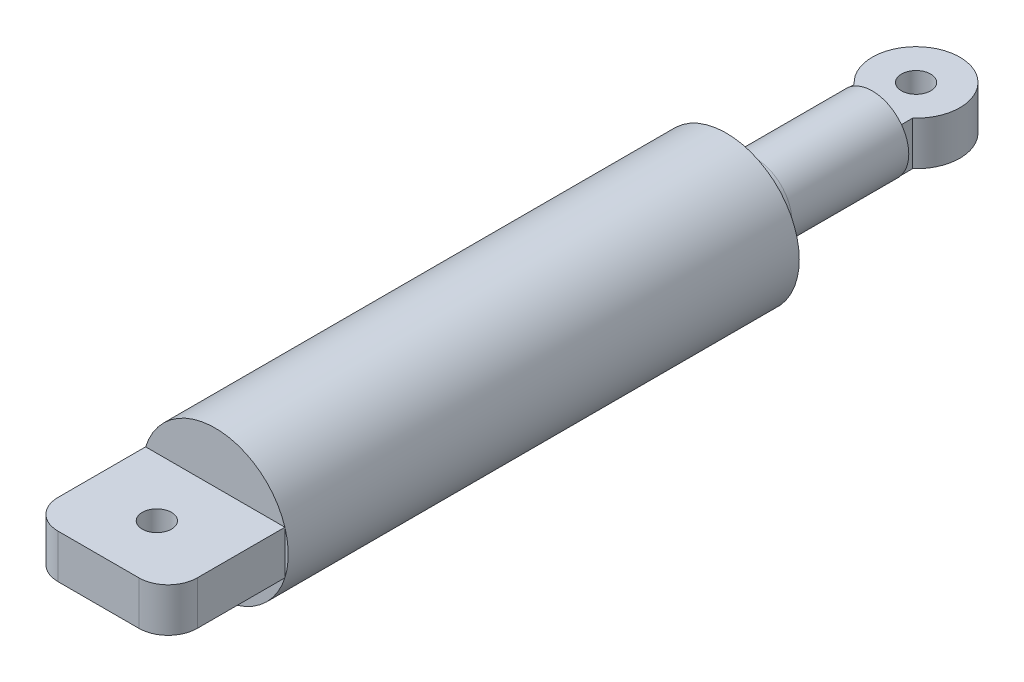
ISO-10303-21;
HEADER;
FILE_DESCRIPTION(('STEP AP214'),'2;1');
FILE_NAME('part.step','',(''),(''),'','','');
FILE_SCHEMA(('AUTOMOTIVE_DESIGN { 1 0 10303 214 1 1 1 1 }'));
ENDSEC;
DATA;
#1=APPLICATION_CONTEXT('core data for automotive mechanical design processes');
#2=APPLICATION_PROTOCOL_DEFINITION('international standard','automotive_design',2000,#1);
#3=PRODUCT_CONTEXT('',#1,'mechanical');
#4=PRODUCT('Part','Part','',(#3));
#5=PRODUCT_RELATED_PRODUCT_CATEGORY('part','',(#4));
#6=PRODUCT_DEFINITION_FORMATION('','',#4);
#7=PRODUCT_DEFINITION_CONTEXT('part definition',#1,'design');
#8=PRODUCT_DEFINITION('design','',#6,#7);
#9=PRODUCT_DEFINITION_SHAPE('','',#8);
#10=(LENGTH_UNIT() NAMED_UNIT(*) SI_UNIT(.MILLI.,.METRE.));
#11=(NAMED_UNIT(*) PLANE_ANGLE_UNIT() SI_UNIT($,.RADIAN.));
#12=(NAMED_UNIT(*) SI_UNIT($,.STERADIAN.) SOLID_ANGLE_UNIT());
#13=UNCERTAINTY_MEASURE_WITH_UNIT(LENGTH_MEASURE(1.E-05),#10,'distance_accuracy_value','');
#14=(GEOMETRIC_REPRESENTATION_CONTEXT(3) GLOBAL_UNCERTAINTY_ASSIGNED_CONTEXT((#13)) GLOBAL_UNIT_ASSIGNED_CONTEXT((#10,
#11,#12)) REPRESENTATION_CONTEXT('',''));
#15=CARTESIAN_POINT('',(0.,0.,0.));
#16=DIRECTION('',(0.,0.,1.));
#17=DIRECTION('',(1.,0.,0.));
#18=AXIS2_PLACEMENT_3D('',#15,#16,#17);
#19=CARTESIAN_POINT('',(0.,0.,-10.));
#20=DIRECTION('',(0.,0.,-1.));
#21=DIRECTION('',(-1.,0.,0.));
#22=AXIS2_PLACEMENT_3D('',#19,#20,#21);
#23=PLANE('',#22);
#24=DIRECTION('',(0.,1.,0.));
#25=VECTOR('',#24,1.);
#26=CARTESIAN_POINT('',(-2.,1.5,-10.));
#27=LINE('',#26,#25);
#28=CARTESIAN_POINT('',(-2.,-1.5,-10.));
#29=VERTEX_POINT('',#28);
#30=CARTESIAN_POINT('',(-2.,1.5,-10.));
#31=VERTEX_POINT('',#30);
#32=EDGE_CURVE('E137',#29,#31,#27,.T.);
#33=ORIENTED_EDGE('',*,*,#32,.F.);
#34=CARTESIAN_POINT('',(0.,0.,-10.));
#35=DIRECTION('',(0.,0.,-1.));
#36=DIRECTION('',(-1.,0.,0.));
#37=AXIS2_PLACEMENT_3D('',#34,#35,#36);
#38=CIRCLE('',#37,2.5);
#39=EDGE_CURVE('E159',#29,#31,#38,.T.);
#40=ORIENTED_EDGE('',*,*,#39,.T.);
#41=EDGE_LOOP('',(#33,#40));
#42=FACE_BOUND('',#41,.T.);
#43=ADVANCED_FACE('F44',(#42),#23,.T.);
#44=DIRECTION('',(-1.,0.,0.));
#45=VECTOR('',#44,1.);
#46=CARTESIAN_POINT('',(2.,-1.5,-10.));
#47=LINE('',#46,#45);
#48=CARTESIAN_POINT('',(2.,-1.5,-10.));
#49=VERTEX_POINT('',#48);
#50=EDGE_CURVE('E169',#49,#29,#47,.T.);
#51=ORIENTED_EDGE('',*,*,#50,.F.);
#52=EDGE_CURVE('E164',#49,#29,#38,.T.);
#53=ORIENTED_EDGE('',*,*,#52,.T.);
#54=EDGE_LOOP('',(#51,#53));
#55=FACE_BOUND('',#54,.T.);
#56=ADVANCED_FACE('F291',(#55),#23,.T.);
#57=DIRECTION('',(0.,-1.,0.));
#58=VECTOR('',#57,1.);
#59=CARTESIAN_POINT('',(2.,1.5,-10.));
#60=LINE('',#59,#58);
#61=CARTESIAN_POINT('',(2.,1.5,-10.));
#62=VERTEX_POINT('',#61);
#63=EDGE_CURVE('E136',#62,#49,#60,.T.);
#64=ORIENTED_EDGE('',*,*,#63,.F.);
#65=EDGE_CURVE('E157',#62,#49,#38,.T.);
#66=ORIENTED_EDGE('',*,*,#65,.T.);
#67=EDGE_LOOP('',(#64,#66));
#68=FACE_BOUND('',#67,.T.);
#69=ADVANCED_FACE('F167',(#68),#23,.T.);
#70=CARTESIAN_POINT('',(0.,0.,35.));
#71=DIRECTION('',(0.,0.,1.));
#72=DIRECTION('',(1.,0.,0.));
#73=AXIS2_PLACEMENT_3D('',#70,#71,#72);
#74=PLANE('',#73);
#75=DIRECTION('',(0.,1.,0.));
#76=VECTOR('',#75,1.);
#77=CARTESIAN_POINT('',(4.76969600708473,1.5,35.));
#78=LINE('',#77,#76);
#79=CARTESIAN_POINT('',(4.76969600708473,-1.5,35.));
#80=VERTEX_POINT('',#79);
#81=CARTESIAN_POINT('',(4.76969600708473,1.5,35.));
#82=VERTEX_POINT('',#81);
#83=EDGE_CURVE('E156',#80,#82,#78,.T.);
#84=ORIENTED_EDGE('',*,*,#83,.F.);
#85=CARTESIAN_POINT('',(0.,0.,35.));
#86=DIRECTION('',(0.,0.,1.));
#87=DIRECTION('',(1.,0.,0.));
#88=AXIS2_PLACEMENT_3D('',#85,#86,#87);
#89=CIRCLE('',#88,5.);
#90=EDGE_CURVE('E225',#80,#82,#89,.T.);
#91=ORIENTED_EDGE('',*,*,#90,.T.);
#92=EDGE_LOOP('',(#84,#91));
#93=FACE_BOUND('',#92,.T.);
#94=ADVANCED_FACE('F322',(#93),#74,.T.);
#95=DIRECTION('',(1.,0.,0.));
#96=VECTOR('',#95,1.);
#97=CARTESIAN_POINT('',(-4.76969600708473,-1.5,35.));
#98=LINE('',#97,#96);
#99=CARTESIAN_POINT('',(-4.76969600708473,-1.5,35.));
#100=VERTEX_POINT('',#99);
#101=EDGE_CURVE('E188',#100,#80,#98,.T.);
#102=ORIENTED_EDGE('',*,*,#101,.F.);
#103=EDGE_CURVE('E296',#100,#80,#89,.T.);
#104=ORIENTED_EDGE('',*,*,#103,.T.);
#105=EDGE_LOOP('',(#102,#104));
#106=FACE_BOUND('',#105,.T.);
#107=ADVANCED_FACE('F324',(#106),#74,.T.);
#108=DIRECTION('',(0.,-1.,0.));
#109=VECTOR('',#108,1.);
#110=CARTESIAN_POINT('',(-4.76969600708473,1.5,35.));
#111=LINE('',#110,#109);
#112=CARTESIAN_POINT('',(-4.76969600708473,1.5,35.));
#113=VERTEX_POINT('',#112);
#114=EDGE_CURVE('E200',#113,#100,#111,.T.);
#115=ORIENTED_EDGE('',*,*,#114,.F.);
#116=EDGE_CURVE('E224',#113,#100,#89,.T.);
#117=ORIENTED_EDGE('',*,*,#116,.T.);
#118=EDGE_LOOP('',(#115,#117));
#119=FACE_BOUND('',#118,.T.);
#120=ADVANCED_FACE('F303',(#119),#74,.T.);
#121=CARTESIAN_POINT('',(0.,0.,35.));
#122=DIRECTION('',(0.,0.,-1.));
#123=DIRECTION('',(-1.,0.,0.));
#124=AXIS2_PLACEMENT_3D('',#121,#122,#123);
#125=CYLINDRICAL_SURFACE('',#124,5.);
#126=EDGE_CURVE('E219',#82,#113,#89,.T.);
#127=ORIENTED_EDGE('',*,*,#126,.F.);
#128=ORIENTED_EDGE('',*,*,#90,.F.);
#129=ORIENTED_EDGE('',*,*,#103,.F.);
#130=ORIENTED_EDGE('',*,*,#116,.F.);
#131=EDGE_LOOP('',(#127,#128,#129,#130));
#132=FACE_BOUND('',#131,.T.);
#133=CARTESIAN_POINT('',(0.,0.,0.));
#134=DIRECTION('',(0.,0.,1.));
#135=DIRECTION('',(1.,0.,0.));
#136=AXIS2_PLACEMENT_3D('',#133,#134,#135);
#137=CIRCLE('',#136,5.);
#138=CARTESIAN_POINT('',(5.,0.,0.));
#139=VERTEX_POINT('',#138);
#140=EDGE_CURVE('E218',#139,#139,#137,.T.);
#141=ORIENTED_EDGE('',*,*,#140,.T.);
#142=EDGE_LOOP('',(#141));
#143=FACE_BOUND('',#142,.T.);
#144=ADVANCED_FACE('F317',(#132,#143),#125,.T.);
#145=DIRECTION('',(-1.,0.,0.));
#146=VECTOR('',#145,1.);
#147=CARTESIAN_POINT('',(-4.76969600708473,1.5,35.));
#148=LINE('',#147,#146);
#149=EDGE_CURVE('E196',#82,#113,#148,.T.);
#150=ORIENTED_EDGE('',*,*,#149,.F.);
#151=ORIENTED_EDGE('',*,*,#126,.T.);
#152=EDGE_LOOP('',(#150,#151));
#153=FACE_BOUND('',#152,.T.);
#154=ADVANCED_FACE('F315',(#153),#74,.T.);
#155=CARTESIAN_POINT('',(0.,0.,0.));
#156=DIRECTION('',(0.,0.,1.));
#157=DIRECTION('',(1.,0.,0.));
#158=AXIS2_PLACEMENT_3D('',#155,#156,#157);
#159=PLANE('',#158);
#160=CARTESIAN_POINT('',(0.,0.,0.));
#161=DIRECTION('',(0.,0.,1.));
#162=DIRECTION('',(1.,0.,0.));
#163=AXIS2_PLACEMENT_3D('',#160,#161,#162);
#164=CIRCLE('',#163,4.5);
#165=CARTESIAN_POINT('',(4.5,0.,0.));
#166=VERTEX_POINT('',#165);
#167=EDGE_CURVE('E11',#166,#166,#164,.T.);
#168=ORIENTED_EDGE('',*,*,#167,.T.);
#169=EDGE_LOOP('',(#168));
#170=FACE_BOUND('',#169,.T.);
#171=ORIENTED_EDGE('',*,*,#140,.F.);
#172=EDGE_LOOP('',(#171));
#173=FACE_BOUND('',#172,.T.);
#174=ADVANCED_FACE('F335',(#170,#173),#159,.F.);
#175=CARTESIAN_POINT('',(4.76969600708473,1.5,43.));
#176=DIRECTION('',(-1.,0.,0.));
#177=DIRECTION('',(0.,0.,1.));
#178=AXIS2_PLACEMENT_3D('',#175,#176,#177);
#179=PLANE('',#178);
#180=DIRECTION('',(0.,0.,-1.));
#181=VECTOR('',#180,1.);
#182=CARTESIAN_POINT('',(4.76969600708473,1.5,43.));
#183=LINE('',#182,#181);
#184=CARTESIAN_POINT('',(4.76969600708473,1.5,41.));
#185=VERTEX_POINT('',#184);
#186=EDGE_CURVE('E215',#185,#82,#183,.T.);
#187=ORIENTED_EDGE('',*,*,#186,.F.);
#188=DIRECTION('',(0.,1.,0.));
#189=VECTOR('',#188,1.);
#190=CARTESIAN_POINT('',(4.76969600708473,-1.5,41.));
#191=LINE('',#190,#189);
#192=CARTESIAN_POINT('',(4.76969600708473,-1.5,41.));
#193=VERTEX_POINT('',#192);
#194=EDGE_CURVE('E70',#185,#193,#191,.F.);
#195=ORIENTED_EDGE('',*,*,#194,.T.);
#196=DIRECTION('',(0.,0.,-1.));
#197=VECTOR('',#196,1.);
#198=CARTESIAN_POINT('',(4.76969600708473,-1.5,43.));
#199=LINE('',#198,#197);
#200=EDGE_CURVE('E192',#193,#80,#199,.T.);
#201=ORIENTED_EDGE('',*,*,#200,.T.);
#202=ORIENTED_EDGE('',*,*,#83,.T.);
#203=EDGE_LOOP('',(#187,#195,#201,#202));
#204=FACE_BOUND('',#203,.T.);
#205=ADVANCED_FACE('F320',(#204),#179,.F.);
#206=CARTESIAN_POINT('',(-4.76969600708473,1.5,43.));
#207=DIRECTION('',(0.,-1.,0.));
#208=DIRECTION('',(0.,0.,-1.));
#209=AXIS2_PLACEMENT_3D('',#206,#207,#208);
#210=PLANE('',#209);
#211=CARTESIAN_POINT('',(0.,1.5,39.));
#212=DIRECTION('',(0.,1.,0.));
#213=DIRECTION('',(0.,0.,1.));
#214=AXIS2_PLACEMENT_3D('',#211,#212,#213);
#215=CIRCLE('',#214,1.);
#216=CARTESIAN_POINT('',(0.,1.5,40.));
#217=VERTEX_POINT('',#216);
#218=EDGE_CURVE('E272',#217,#217,#215,.T.);
#219=ORIENTED_EDGE('',*,*,#218,.F.);
#220=EDGE_LOOP('',(#219));
#221=FACE_BOUND('',#220,.T.);
#222=DIRECTION('',(-1.,0.,0.));
#223=VECTOR('',#222,1.);
#224=CARTESIAN_POINT('',(-4.76969600708473,1.5,43.));
#225=LINE('',#224,#223);
#226=CARTESIAN_POINT('',(2.76969600708473,1.5,43.));
#227=VERTEX_POINT('',#226);
#228=CARTESIAN_POINT('',(-2.76969600708473,1.5,43.));
#229=VERTEX_POINT('',#228);
#230=EDGE_CURVE('E183',#227,#229,#225,.T.);
#231=ORIENTED_EDGE('',*,*,#230,.F.);
#232=CARTESIAN_POINT('',(2.76969600708473,1.5,41.));
#233=DIRECTION('',(0.,-1.,0.));
#234=DIRECTION('',(0.,0.,-1.));
#235=AXIS2_PLACEMENT_3D('',#232,#233,#234);
#236=CIRCLE('',#235,2.);
#237=EDGE_CURVE('E239',#227,#185,#236,.F.);
#238=ORIENTED_EDGE('',*,*,#237,.T.);
#239=ORIENTED_EDGE('',*,*,#186,.T.);
#240=ORIENTED_EDGE('',*,*,#149,.T.);
#241=DIRECTION('',(0.,0.,-1.));
#242=VECTOR('',#241,1.);
#243=CARTESIAN_POINT('',(-4.76969600708473,1.5,43.));
#244=LINE('',#243,#242);
#245=CARTESIAN_POINT('',(-4.76969600708473,1.5,41.));
#246=VERTEX_POINT('',#245);
#247=EDGE_CURVE('E212',#246,#113,#244,.T.);
#248=ORIENTED_EDGE('',*,*,#247,.F.);
#249=CARTESIAN_POINT('',(-2.76969600708473,1.5,41.));
#250=DIRECTION('',(0.,-1.,0.));
#251=DIRECTION('',(0.,0.,-1.));
#252=AXIS2_PLACEMENT_3D('',#249,#250,#251);
#253=CIRCLE('',#252,2.);
#254=EDGE_CURVE('E236',#246,#229,#253,.F.);
#255=ORIENTED_EDGE('',*,*,#254,.T.);
#256=EDGE_LOOP('',(#231,#238,#239,#240,#248,#255));
#257=FACE_BOUND('',#256,.T.);
#258=ADVANCED_FACE('F363',(#221,#257),#210,.F.);
#259=CARTESIAN_POINT('',(-4.76969600708473,1.5,43.));
#260=DIRECTION('',(1.,0.,0.));
#261=DIRECTION('',(0.,0.,-1.));
#262=AXIS2_PLACEMENT_3D('',#259,#260,#261);
#263=PLANE('',#262);
#264=DIRECTION('',(0.,0.,-1.));
#265=VECTOR('',#264,1.);
#266=CARTESIAN_POINT('',(-4.76969600708473,-1.5,43.));
#267=LINE('',#266,#265);
#268=CARTESIAN_POINT('',(-4.76969600708473,-1.5,41.));
#269=VERTEX_POINT('',#268);
#270=EDGE_CURVE('E209',#269,#100,#267,.T.);
#271=ORIENTED_EDGE('',*,*,#270,.F.);
#272=DIRECTION('',(0.,-1.,0.));
#273=VECTOR('',#272,1.);
#274=CARTESIAN_POINT('',(-4.76969600708473,1.5,41.));
#275=LINE('',#274,#273);
#276=EDGE_CURVE('E249',#269,#246,#275,.F.);
#277=ORIENTED_EDGE('',*,*,#276,.T.);
#278=ORIENTED_EDGE('',*,*,#247,.T.);
#279=ORIENTED_EDGE('',*,*,#114,.T.);
#280=EDGE_LOOP('',(#271,#277,#278,#279));
#281=FACE_BOUND('',#280,.T.);
#282=ADVANCED_FACE('F308',(#281),#263,.F.);
#283=CARTESIAN_POINT('',(-4.76969600708473,-1.5,43.));
#284=DIRECTION('',(0.,1.,0.));
#285=DIRECTION('',(0.,0.,1.));
#286=AXIS2_PLACEMENT_3D('',#283,#284,#285);
#287=PLANE('',#286);
#288=CARTESIAN_POINT('',(0.,-1.5,39.));
#289=DIRECTION('',(0.,1.,0.));
#290=DIRECTION('',(0.,0.,1.));
#291=AXIS2_PLACEMENT_3D('',#288,#289,#290);
#292=CIRCLE('',#291,1.);
#293=CARTESIAN_POINT('',(0.,-1.5,40.));
#294=VERTEX_POINT('',#293);
#295=EDGE_CURVE('E48',#294,#294,#292,.T.);
#296=ORIENTED_EDGE('',*,*,#295,.T.);
#297=EDGE_LOOP('',(#296));
#298=FACE_BOUND('',#297,.T.);
#299=ORIENTED_EDGE('',*,*,#200,.F.);
#300=CARTESIAN_POINT('',(2.76969600708473,-1.5,41.));
#301=DIRECTION('',(0.,1.,0.));
#302=DIRECTION('',(0.,0.,1.));
#303=AXIS2_PLACEMENT_3D('',#300,#301,#302);
#304=CIRCLE('',#303,2.);
#305=CARTESIAN_POINT('',(2.76969600708473,-1.5,43.));
#306=VERTEX_POINT('',#305);
#307=EDGE_CURVE('E246',#193,#306,#304,.F.);
#308=ORIENTED_EDGE('',*,*,#307,.T.);
#309=DIRECTION('',(1.,0.,0.));
#310=VECTOR('',#309,1.);
#311=CARTESIAN_POINT('',(-4.76969600708473,-1.5,43.));
#312=LINE('',#311,#310);
#313=CARTESIAN_POINT('',(-2.76969600708473,-1.5,43.));
#314=VERTEX_POINT('',#313);
#315=EDGE_CURVE('E187',#314,#306,#312,.T.);
#316=ORIENTED_EDGE('',*,*,#315,.F.);
#317=CARTESIAN_POINT('',(-2.76969600708473,-1.5,41.));
#318=DIRECTION('',(0.,1.,0.));
#319=DIRECTION('',(0.,0.,1.));
#320=AXIS2_PLACEMENT_3D('',#317,#318,#319);
#321=CIRCLE('',#320,2.);
#322=EDGE_CURVE('E62',#314,#269,#321,.F.);
#323=ORIENTED_EDGE('',*,*,#322,.T.);
#324=ORIENTED_EDGE('',*,*,#270,.T.);
#325=ORIENTED_EDGE('',*,*,#101,.T.);
#326=EDGE_LOOP('',(#299,#308,#316,#323,#324,#325));
#327=FACE_BOUND('',#326,.T.);
#328=ADVANCED_FACE('F354',(#298,#327),#287,.F.);
#329=CARTESIAN_POINT('',(0.,0.,43.));
#330=DIRECTION('',(0.,0.,1.));
#331=DIRECTION('',(1.,0.,0.));
#332=AXIS2_PLACEMENT_3D('',#329,#330,#331);
#333=PLANE('',#332);
#334=ORIENTED_EDGE('',*,*,#315,.T.);
#335=DIRECTION('',(0.,1.,0.));
#336=VECTOR('',#335,1.);
#337=CARTESIAN_POINT('',(2.76969600708473,1.5,43.));
#338=LINE('',#337,#336);
#339=EDGE_CURVE('E232',#306,#227,#338,.T.);
#340=ORIENTED_EDGE('',*,*,#339,.T.);
#341=ORIENTED_EDGE('',*,*,#230,.T.);
#342=DIRECTION('',(0.,-1.,0.));
#343=VECTOR('',#342,1.);
#344=CARTESIAN_POINT('',(-2.76969600708473,-1.5,43.));
#345=LINE('',#344,#343);
#346=EDGE_CURVE('E223',#229,#314,#345,.T.);
#347=ORIENTED_EDGE('',*,*,#346,.T.);
#348=EDGE_LOOP('',(#334,#340,#341,#347));
#349=FACE_BOUND('',#348,.T.);
#350=ADVANCED_FACE('F347',(#349),#333,.T.);
#351=CARTESIAN_POINT('',(0.,0.,-10.));
#352=DIRECTION('',(0.,0.,1.));
#353=DIRECTION('',(1.,0.,0.));
#354=AXIS2_PLACEMENT_3D('',#351,#352,#353);
#355=CYLINDRICAL_SURFACE('',#354,2.5);
#356=CARTESIAN_POINT('',(0.,0.,-2.));
#357=DIRECTION('',(0.,0.,1.));
#358=DIRECTION('',(1.,0.,0.));
#359=AXIS2_PLACEMENT_3D('',#356,#357,#358);
#360=CIRCLE('',#359,2.5);
#361=CARTESIAN_POINT('',(2.5,0.,-2.));
#362=VERTEX_POINT('',#361);
#363=EDGE_CURVE('E54',#362,#362,#360,.F.);
#364=ORIENTED_EDGE('',*,*,#363,.T.);
#365=EDGE_LOOP('',(#364));
#366=FACE_BOUND('',#365,.T.);
#367=EDGE_CURVE('E149',#31,#62,#38,.T.);
#368=ORIENTED_EDGE('',*,*,#367,.F.);
#369=ORIENTED_EDGE('',*,*,#39,.F.);
#370=ORIENTED_EDGE('',*,*,#52,.F.);
#371=ORIENTED_EDGE('',*,*,#65,.F.);
#372=EDGE_LOOP('',(#368,#369,#370,#371));
#373=FACE_BOUND('',#372,.T.);
#374=ADVANCED_FACE('F162',(#366,#373),#355,.T.);
#375=DIRECTION('',(1.,0.,0.));
#376=VECTOR('',#375,1.);
#377=CARTESIAN_POINT('',(2.,1.5,-10.));
#378=LINE('',#377,#376);
#379=EDGE_CURVE('E125',#31,#62,#378,.T.);
#380=ORIENTED_EDGE('',*,*,#379,.F.);
#381=ORIENTED_EDGE('',*,*,#367,.T.);
#382=EDGE_LOOP('',(#380,#381));
#383=FACE_BOUND('',#382,.T.);
#384=ADVANCED_FACE('F151',(#383),#23,.T.);
#385=CARTESIAN_POINT('',(-2.,1.5,-13.));
#386=DIRECTION('',(1.,0.,0.));
#387=DIRECTION('',(0.,0.,-1.));
#388=AXIS2_PLACEMENT_3D('',#385,#386,#387);
#389=PLANE('',#388);
#390=DIRECTION('',(0.,0.,1.));
#391=VECTOR('',#390,1.);
#392=CARTESIAN_POINT('',(-2.,1.5,-13.));
#393=LINE('',#392,#391);
#394=CARTESIAN_POINT('',(-2.,1.5,-10.7639320225002));
#395=VERTEX_POINT('',#394);
#396=EDGE_CURVE('E131',#395,#31,#393,.T.);
#397=ORIENTED_EDGE('',*,*,#396,.F.);
#398=DIRECTION('',(0.,-1.,0.));
#399=VECTOR('',#398,1.);
#400=CARTESIAN_POINT('',(-2.,1.5,-10.7639320225002));
#401=LINE('',#400,#399);
#402=CARTESIAN_POINT('',(-2.,-1.5,-10.7639320225002));
#403=VERTEX_POINT('',#402);
#404=EDGE_CURVE('E279',#395,#403,#401,.T.);
#405=ORIENTED_EDGE('',*,*,#404,.T.);
#406=DIRECTION('',(0.,0.,1.));
#407=VECTOR('',#406,1.);
#408=CARTESIAN_POINT('',(-2.,-1.5,-13.));
#409=LINE('',#408,#407);
#410=EDGE_CURVE('E172',#403,#29,#409,.T.);
#411=ORIENTED_EDGE('',*,*,#410,.T.);
#412=ORIENTED_EDGE('',*,*,#32,.T.);
#413=EDGE_LOOP('',(#397,#405,#411,#412));
#414=FACE_BOUND('',#413,.T.);
#415=ADVANCED_FACE('F284',(#414),#389,.F.);
#416=CARTESIAN_POINT('',(2.,1.5,-13.));
#417=DIRECTION('',(0.,-1.,0.));
#418=DIRECTION('',(0.,0.,-1.));
#419=AXIS2_PLACEMENT_3D('',#416,#417,#418);
#420=PLANE('',#419);
#421=CARTESIAN_POINT('',(0.,1.5,-13.));
#422=DIRECTION('',(0.,1.,0.));
#423=DIRECTION('',(0.,0.,1.));
#424=AXIS2_PLACEMENT_3D('',#421,#422,#423);
#425=CIRCLE('',#424,1.);
#426=CARTESIAN_POINT('',(0.,1.5,-12.));
#427=VERTEX_POINT('',#426);
#428=EDGE_CURVE('E258',#427,#427,#425,.T.);
#429=ORIENTED_EDGE('',*,*,#428,.F.);
#430=EDGE_LOOP('',(#429));
#431=FACE_BOUND('',#430,.T.);
#432=CARTESIAN_POINT('',(0.,1.5,-13.));
#433=DIRECTION('',(0.,-1.,0.));
#434=DIRECTION('',(0.,0.,-1.));
#435=AXIS2_PLACEMENT_3D('',#432,#433,#434);
#436=CIRCLE('',#435,3.);
#437=CARTESIAN_POINT('',(2.,1.5,-10.7639320225002));
#438=VERTEX_POINT('',#437);
#439=EDGE_CURVE('E264',#395,#438,#436,.T.);
#440=ORIENTED_EDGE('',*,*,#439,.F.);
#441=ORIENTED_EDGE('',*,*,#396,.T.);
#442=ORIENTED_EDGE('',*,*,#379,.T.);
#443=DIRECTION('',(0.,0.,1.));
#444=VECTOR('',#443,1.);
#445=CARTESIAN_POINT('',(2.,1.5,-13.));
#446=LINE('',#445,#444);
#447=EDGE_CURVE('E129',#438,#62,#446,.T.);
#448=ORIENTED_EDGE('',*,*,#447,.F.);
#449=EDGE_LOOP('',(#440,#441,#442,#448));
#450=FACE_BOUND('',#449,.T.);
#451=ADVANCED_FACE('F128',(#431,#450),#420,.F.);
#452=CARTESIAN_POINT('',(2.,1.5,-13.));
#453=DIRECTION('',(-1.,0.,0.));
#454=DIRECTION('',(0.,0.,1.));
#455=AXIS2_PLACEMENT_3D('',#452,#453,#454);
#456=PLANE('',#455);
#457=DIRECTION('',(0.,0.,1.));
#458=VECTOR('',#457,1.);
#459=CARTESIAN_POINT('',(2.,-1.5,-13.));
#460=LINE('',#459,#458);
#461=CARTESIAN_POINT('',(2.,-1.5,-10.7639320225002));
#462=VERTEX_POINT('',#461);
#463=EDGE_CURVE('E146',#462,#49,#460,.T.);
#464=ORIENTED_EDGE('',*,*,#463,.F.);
#465=DIRECTION('',(0.,-1.,0.));
#466=VECTOR('',#465,1.);
#467=CARTESIAN_POINT('',(2.,1.5,-10.7639320225002));
#468=LINE('',#467,#466);
#469=EDGE_CURVE('E144',#462,#438,#468,.F.);
#470=ORIENTED_EDGE('',*,*,#469,.T.);
#471=ORIENTED_EDGE('',*,*,#447,.T.);
#472=ORIENTED_EDGE('',*,*,#63,.T.);
#473=EDGE_LOOP('',(#464,#470,#471,#472));
#474=FACE_BOUND('',#473,.T.);
#475=ADVANCED_FACE('F141',(#474),#456,.F.);
#476=CARTESIAN_POINT('',(2.,-1.5,-13.));
#477=DIRECTION('',(0.,1.,0.));
#478=DIRECTION('',(0.,0.,1.));
#479=AXIS2_PLACEMENT_3D('',#476,#477,#478);
#480=PLANE('',#479);
#481=CARTESIAN_POINT('',(0.,-1.5,-13.));
#482=DIRECTION('',(0.,1.,0.));
#483=DIRECTION('',(0.,0.,1.));
#484=AXIS2_PLACEMENT_3D('',#481,#482,#483);
#485=CIRCLE('',#484,1.);
#486=CARTESIAN_POINT('',(0.,-1.5,-12.));
#487=VERTEX_POINT('',#486);
#488=EDGE_CURVE('E254',#487,#487,#485,.T.);
#489=ORIENTED_EDGE('',*,*,#488,.T.);
#490=EDGE_LOOP('',(#489));
#491=FACE_BOUND('',#490,.T.);
#492=ORIENTED_EDGE('',*,*,#410,.F.);
#493=CARTESIAN_POINT('',(0.,-1.5,-13.));
#494=DIRECTION('',(0.,-1.,0.));
#495=DIRECTION('',(0.,0.,-1.));
#496=AXIS2_PLACEMENT_3D('',#493,#494,#495);
#497=CIRCLE('',#496,3.);
#498=EDGE_CURVE('E257',#403,#462,#497,.T.);
#499=ORIENTED_EDGE('',*,*,#498,.T.);
#500=ORIENTED_EDGE('',*,*,#463,.T.);
#501=ORIENTED_EDGE('',*,*,#50,.T.);
#502=EDGE_LOOP('',(#492,#499,#500,#501));
#503=FACE_BOUND('',#502,.T.);
#504=ADVANCED_FACE('F411',(#491,#503),#480,.F.);
#505=CARTESIAN_POINT('',(0.,1.5,-13.));
#506=DIRECTION('',(0.,-1.,0.));
#507=DIRECTION('',(0.,0.,-1.));
#508=AXIS2_PLACEMENT_3D('',#505,#506,#507);
#509=CYLINDRICAL_SURFACE('',#508,3.);
#510=ORIENTED_EDGE('',*,*,#404,.F.);
#511=ORIENTED_EDGE('',*,*,#439,.T.);
#512=ORIENTED_EDGE('',*,*,#469,.F.);
#513=ORIENTED_EDGE('',*,*,#498,.F.);
#514=EDGE_LOOP('',(#510,#511,#512,#513));
#515=FACE_BOUND('',#514,.T.);
#516=ADVANCED_FACE('F381',(#515),#509,.T.);
#517=CARTESIAN_POINT('',(2.76969600708473,0.,41.));
#518=DIRECTION('',(0.,-1.,0.));
#519=DIRECTION('',(0.,0.,-1.));
#520=AXIS2_PLACEMENT_3D('',#517,#518,#519);
#521=CYLINDRICAL_SURFACE('',#520,2.);
#522=ORIENTED_EDGE('',*,*,#307,.F.);
#523=ORIENTED_EDGE('',*,*,#194,.F.);
#524=ORIENTED_EDGE('',*,*,#237,.F.);
#525=ORIENTED_EDGE('',*,*,#339,.F.);
#526=EDGE_LOOP('',(#522,#523,#524,#525));
#527=FACE_BOUND('',#526,.T.);
#528=ADVANCED_FACE('F378',(#527),#521,.T.);
#529=CARTESIAN_POINT('',(-2.76969600708473,0.,41.));
#530=DIRECTION('',(0.,1.,0.));
#531=DIRECTION('',(0.,0.,1.));
#532=AXIS2_PLACEMENT_3D('',#529,#530,#531);
#533=CYLINDRICAL_SURFACE('',#532,2.);
#534=ORIENTED_EDGE('',*,*,#254,.F.);
#535=ORIENTED_EDGE('',*,*,#276,.F.);
#536=ORIENTED_EDGE('',*,*,#322,.F.);
#537=ORIENTED_EDGE('',*,*,#346,.F.);
#538=EDGE_LOOP('',(#534,#535,#536,#537));
#539=FACE_BOUND('',#538,.T.);
#540=ADVANCED_FACE('F380',(#539),#533,.T.);
#541=CARTESIAN_POINT('',(0.,0.,-2.));
#542=DIRECTION('',(0.,0.,1.));
#543=DIRECTION('',(1.,0.,0.));
#544=AXIS2_PLACEMENT_3D('',#541,#542,#543);
#545=TOROIDAL_SURFACE('',#544,4.5,2.);
#546=ORIENTED_EDGE('',*,*,#167,.F.);
#547=EDGE_LOOP('',(#546));
#548=FACE_BOUND('',#547,.T.);
#549=ORIENTED_EDGE('',*,*,#363,.F.);
#550=EDGE_LOOP('',(#549));
#551=FACE_BOUND('',#550,.T.);
#552=ADVANCED_FACE('F46',(#548,#551),#545,.F.);
#553=CARTESIAN_POINT('',(0.,-5.,-13.));
#554=DIRECTION('',(0.,1.,0.));
#555=DIRECTION('',(0.,0.,1.));
#556=AXIS2_PLACEMENT_3D('',#553,#554,#555);
#557=CYLINDRICAL_SURFACE('',#556,1.);
#558=ORIENTED_EDGE('',*,*,#428,.T.);
#559=EDGE_LOOP('',(#558));
#560=FACE_BOUND('',#559,.T.);
#561=ORIENTED_EDGE('',*,*,#488,.F.);
#562=EDGE_LOOP('',(#561));
#563=FACE_BOUND('',#562,.T.);
#564=ADVANCED_FACE('F386',(#560,#563),#557,.F.);
#565=CARTESIAN_POINT('',(0.,-5.,39.));
#566=DIRECTION('',(0.,1.,0.));
#567=DIRECTION('',(0.,0.,1.));
#568=AXIS2_PLACEMENT_3D('',#565,#566,#567);
#569=CYLINDRICAL_SURFACE('',#568,1.);
#570=ORIENTED_EDGE('',*,*,#218,.T.);
#571=EDGE_LOOP('',(#570));
#572=FACE_BOUND('',#571,.T.);
#573=ORIENTED_EDGE('',*,*,#295,.F.);
#574=EDGE_LOOP('',(#573));
#575=FACE_BOUND('',#574,.T.);
#576=ADVANCED_FACE('F397',(#572,#575),#569,.F.);
#577=CLOSED_SHELL('',(#43,#56,#69,#94,#107,#120,#144,#154,#174,#205,#258,#282,#328,#350,#374,
#384,#415,#451,#475,#504,#516,#528,#540,#552,#564,#576));
#578=MANIFOLD_SOLID_BREP('B2',#577);
#579=ADVANCED_BREP_SHAPE_REPRESENTATION('',(#18,#578),#14);
#580=SHAPE_DEFINITION_REPRESENTATION(#9,#579);
ENDSEC;
END-ISO-10303-21;
